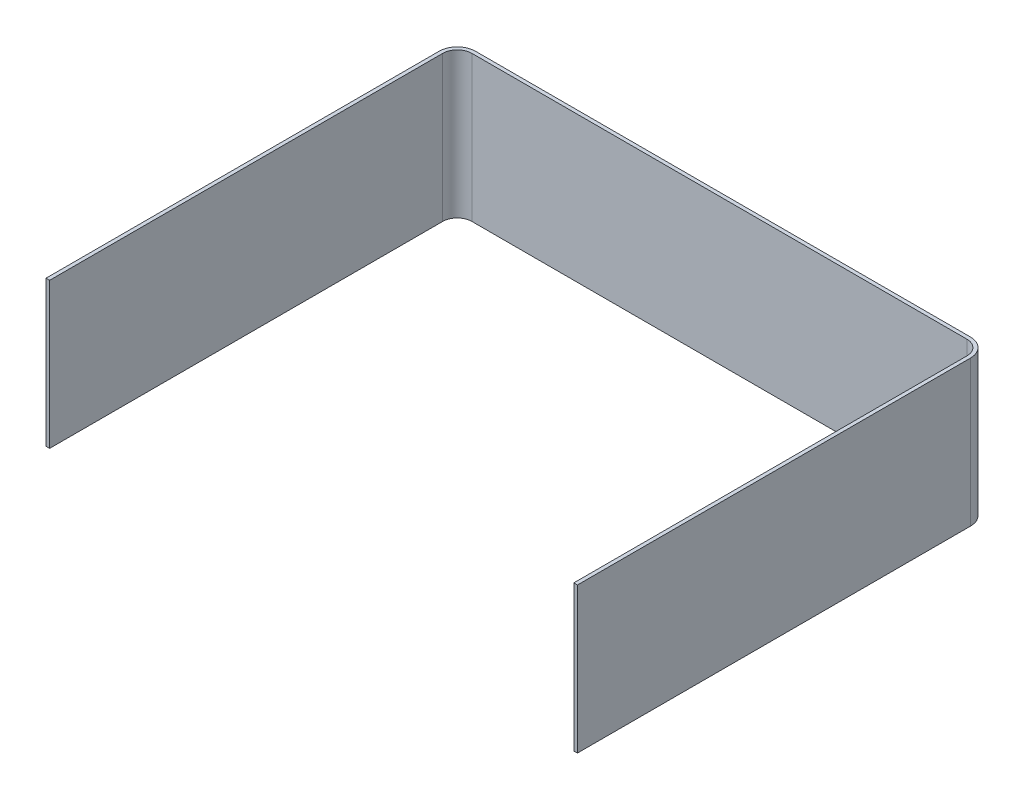
ISO-10303-21;
HEADER;
FILE_DESCRIPTION(('STEP AP214'),'2;1');
FILE_NAME('part.step','',(''),(''),'','','');
FILE_SCHEMA(('AUTOMOTIVE_DESIGN { 1 0 10303 214 1 1 1 1 }'));
ENDSEC;
DATA;
#1=APPLICATION_CONTEXT('core data for automotive mechanical design processes');
#2=APPLICATION_PROTOCOL_DEFINITION('international standard','automotive_design',2000,#1);
#3=PRODUCT_CONTEXT('',#1,'mechanical');
#4=PRODUCT('Part','Part','',(#3));
#5=PRODUCT_RELATED_PRODUCT_CATEGORY('part','',(#4));
#6=PRODUCT_DEFINITION_FORMATION('','',#4);
#7=PRODUCT_DEFINITION_CONTEXT('part definition',#1,'design');
#8=PRODUCT_DEFINITION('design','',#6,#7);
#9=PRODUCT_DEFINITION_SHAPE('','',#8);
#10=(LENGTH_UNIT() NAMED_UNIT(*) SI_UNIT(.MILLI.,.METRE.));
#11=(NAMED_UNIT(*) PLANE_ANGLE_UNIT() SI_UNIT($,.RADIAN.));
#12=(NAMED_UNIT(*) SI_UNIT($,.STERADIAN.) SOLID_ANGLE_UNIT());
#13=UNCERTAINTY_MEASURE_WITH_UNIT(LENGTH_MEASURE(1.E-05),#10,'distance_accuracy_value','');
#14=(GEOMETRIC_REPRESENTATION_CONTEXT(3) GLOBAL_UNCERTAINTY_ASSIGNED_CONTEXT((#13)) GLOBAL_UNIT_ASSIGNED_CONTEXT((#10,
#11,#12)) REPRESENTATION_CONTEXT('',''));
#15=CARTESIAN_POINT('',(0.,0.,0.));
#16=DIRECTION('',(0.,0.,1.));
#17=DIRECTION('',(1.,0.,0.));
#18=AXIS2_PLACEMENT_3D('',#15,#16,#17);
#19=CARTESIAN_POINT('',(215.9,127.,-165.1));
#20=DIRECTION('',(0.,-1.,0.));
#21=DIRECTION('',(0.,0.,-1.));
#22=AXIS2_PLACEMENT_3D('',#19,#20,#21);
#23=CYLINDRICAL_SURFACE('',#22,15.875);
#24=CARTESIAN_POINT('',(215.9,0.,-165.1));
#25=DIRECTION('',(0.,1.,0.));
#26=DIRECTION('',(0.,0.,1.));
#27=AXIS2_PLACEMENT_3D('',#24,#25,#26);
#28=CIRCLE('',#27,15.875);
#29=CARTESIAN_POINT('',(215.9,0.,-180.975));
#30=VERTEX_POINT('',#29);
#31=CARTESIAN_POINT('',(231.775,0.,-165.1));
#32=VERTEX_POINT('',#31);
#33=EDGE_CURVE('E163',#30,#32,#28,.F.);
#34=ORIENTED_EDGE('',*,*,#33,.F.);
#35=DIRECTION('',(0.,-1.,0.));
#36=VECTOR('',#35,1.);
#37=CARTESIAN_POINT('',(215.9,127.,-180.975));
#38=LINE('',#37,#36);
#39=CARTESIAN_POINT('',(215.9,127.,-180.975));
#40=VERTEX_POINT('',#39);
#41=EDGE_CURVE('E11',#40,#30,#38,.T.);
#42=ORIENTED_EDGE('',*,*,#41,.F.);
#43=CARTESIAN_POINT('',(215.9,127.,-165.1));
#44=DIRECTION('',(0.,1.,0.));
#45=DIRECTION('',(0.,0.,1.));
#46=AXIS2_PLACEMENT_3D('',#43,#44,#45);
#47=CIRCLE('',#46,15.875);
#48=CARTESIAN_POINT('',(231.775,127.,-165.1));
#49=VERTEX_POINT('',#48);
#50=EDGE_CURVE('E200',#40,#49,#47,.F.);
#51=ORIENTED_EDGE('',*,*,#50,.T.);
#52=DIRECTION('',(0.,-1.,0.));
#53=VECTOR('',#52,1.);
#54=CARTESIAN_POINT('',(231.775,127.,-165.1));
#55=LINE('',#54,#53);
#56=EDGE_CURVE('E102',#49,#32,#55,.T.);
#57=ORIENTED_EDGE('',*,*,#56,.T.);
#58=EDGE_LOOP('',(#34,#42,#51,#57));
#59=FACE_BOUND('',#58,.T.);
#60=ADVANCED_FACE('F39',(#59),#23,.T.);
#61=CARTESIAN_POINT('',(0.,127.,-180.975));
#62=DIRECTION('',(0.,0.,-1.));
#63=DIRECTION('',(-1.,0.,0.));
#64=AXIS2_PLACEMENT_3D('',#61,#62,#63);
#65=PLANE('',#64);
#66=DIRECTION('',(1.,0.,0.));
#67=VECTOR('',#66,1.);
#68=CARTESIAN_POINT('',(0.,0.,-180.975));
#69=LINE('',#68,#67);
#70=CARTESIAN_POINT('',(-215.9,0.,-180.975));
#71=VERTEX_POINT('',#70);
#72=EDGE_CURVE('E167',#71,#30,#69,.T.);
#73=ORIENTED_EDGE('',*,*,#72,.F.);
#74=DIRECTION('',(0.,-1.,0.));
#75=VECTOR('',#74,1.);
#76=CARTESIAN_POINT('',(-215.9,127.,-180.975));
#77=LINE('',#76,#75);
#78=CARTESIAN_POINT('',(-215.9,127.,-180.975));
#79=VERTEX_POINT('',#78);
#80=EDGE_CURVE('E48',#79,#71,#77,.T.);
#81=ORIENTED_EDGE('',*,*,#80,.F.);
#82=DIRECTION('',(1.,0.,0.));
#83=VECTOR('',#82,1.);
#84=CARTESIAN_POINT('',(0.,127.,-180.975));
#85=LINE('',#84,#83);
#86=EDGE_CURVE('E251',#79,#40,#85,.T.);
#87=ORIENTED_EDGE('',*,*,#86,.T.);
#88=ORIENTED_EDGE('',*,*,#41,.T.);
#89=EDGE_LOOP('',(#73,#81,#87,#88));
#90=FACE_BOUND('',#89,.T.);
#91=ADVANCED_FACE('F239',(#90),#65,.T.);
#92=CARTESIAN_POINT('',(-215.9,127.,-165.1));
#93=DIRECTION('',(0.,-1.,0.));
#94=DIRECTION('',(0.,0.,-1.));
#95=AXIS2_PLACEMENT_3D('',#92,#93,#94);
#96=CYLINDRICAL_SURFACE('',#95,15.875);
#97=CARTESIAN_POINT('',(-215.9,0.,-165.1));
#98=DIRECTION('',(0.,1.,0.));
#99=DIRECTION('',(0.,0.,1.));
#100=AXIS2_PLACEMENT_3D('',#97,#98,#99);
#101=CIRCLE('',#100,15.875);
#102=CARTESIAN_POINT('',(-231.775,0.,-165.1));
#103=VERTEX_POINT('',#102);
#104=EDGE_CURVE('E171',#103,#71,#101,.F.);
#105=ORIENTED_EDGE('',*,*,#104,.F.);
#106=DIRECTION('',(0.,-1.,0.));
#107=VECTOR('',#106,1.);
#108=CARTESIAN_POINT('',(-231.775,127.,-165.1));
#109=LINE('',#108,#107);
#110=CARTESIAN_POINT('',(-231.775,127.,-165.1));
#111=VERTEX_POINT('',#110);
#112=EDGE_CURVE('E226',#111,#103,#109,.T.);
#113=ORIENTED_EDGE('',*,*,#112,.F.);
#114=CARTESIAN_POINT('',(-215.9,127.,-165.1));
#115=DIRECTION('',(0.,1.,0.));
#116=DIRECTION('',(0.,0.,1.));
#117=AXIS2_PLACEMENT_3D('',#114,#115,#116);
#118=CIRCLE('',#117,15.875);
#119=EDGE_CURVE('E235',#111,#79,#118,.F.);
#120=ORIENTED_EDGE('',*,*,#119,.T.);
#121=ORIENTED_EDGE('',*,*,#80,.T.);
#122=EDGE_LOOP('',(#105,#113,#120,#121));
#123=FACE_BOUND('',#122,.T.);
#124=ADVANCED_FACE('F233',(#123),#96,.T.);
#125=CARTESIAN_POINT('',(-231.775,127.,0.));
#126=DIRECTION('',(-1.,0.,0.));
#127=DIRECTION('',(0.,0.,1.));
#128=AXIS2_PLACEMENT_3D('',#125,#126,#127);
#129=PLANE('',#128);
#130=DIRECTION('',(0.,0.,-1.));
#131=VECTOR('',#130,1.);
#132=CARTESIAN_POINT('',(-231.775,0.,0.));
#133=LINE('',#132,#131);
#134=CARTESIAN_POINT('',(-231.775,0.,177.8));
#135=VERTEX_POINT('',#134);
#136=EDGE_CURVE('E175',#135,#103,#133,.T.);
#137=ORIENTED_EDGE('',*,*,#136,.F.);
#138=DIRECTION('',(0.,-1.,0.));
#139=VECTOR('',#138,1.);
#140=CARTESIAN_POINT('',(-231.775,127.,177.8));
#141=LINE('',#140,#139);
#142=CARTESIAN_POINT('',(-231.775,127.,177.8));
#143=VERTEX_POINT('',#142);
#144=EDGE_CURVE('E223',#143,#135,#141,.T.);
#145=ORIENTED_EDGE('',*,*,#144,.F.);
#146=DIRECTION('',(0.,0.,-1.));
#147=VECTOR('',#146,1.);
#148=CARTESIAN_POINT('',(-231.775,127.,0.));
#149=LINE('',#148,#147);
#150=EDGE_CURVE('E250',#143,#111,#149,.T.);
#151=ORIENTED_EDGE('',*,*,#150,.T.);
#152=ORIENTED_EDGE('',*,*,#112,.T.);
#153=EDGE_LOOP('',(#137,#145,#151,#152));
#154=FACE_BOUND('',#153,.T.);
#155=ADVANCED_FACE('F246',(#154),#129,.T.);
#156=CARTESIAN_POINT('',(0.,127.,177.8));
#157=DIRECTION('',(0.,0.,-1.));
#158=DIRECTION('',(-1.,0.,0.));
#159=AXIS2_PLACEMENT_3D('',#156,#157,#158);
#160=PLANE('',#159);
#161=DIRECTION('',(1.,0.,0.));
#162=VECTOR('',#161,1.);
#163=CARTESIAN_POINT('',(0.,0.,177.8));
#164=LINE('',#163,#162);
#165=CARTESIAN_POINT('',(-228.6,0.,177.8));
#166=VERTEX_POINT('',#165);
#167=EDGE_CURVE('E179',#135,#166,#164,.T.);
#168=ORIENTED_EDGE('',*,*,#167,.T.);
#169=DIRECTION('',(0.,-1.,0.));
#170=VECTOR('',#169,1.);
#171=CARTESIAN_POINT('',(-228.6,127.,177.8));
#172=LINE('',#171,#170);
#173=CARTESIAN_POINT('',(-228.6,127.,177.8));
#174=VERTEX_POINT('',#173);
#175=EDGE_CURVE('E219',#174,#166,#172,.T.);
#176=ORIENTED_EDGE('',*,*,#175,.F.);
#177=DIRECTION('',(1.,0.,0.));
#178=VECTOR('',#177,1.);
#179=CARTESIAN_POINT('',(0.,127.,177.8));
#180=LINE('',#179,#178);
#181=EDGE_CURVE('E149',#143,#174,#180,.T.);
#182=ORIENTED_EDGE('',*,*,#181,.F.);
#183=ORIENTED_EDGE('',*,*,#144,.T.);
#184=EDGE_LOOP('',(#168,#176,#182,#183));
#185=FACE_BOUND('',#184,.T.);
#186=ADVANCED_FACE('F291',(#185),#160,.F.);
#187=CARTESIAN_POINT('',(-228.6,127.,0.));
#188=DIRECTION('',(-1.,0.,0.));
#189=DIRECTION('',(0.,0.,1.));
#190=AXIS2_PLACEMENT_3D('',#187,#188,#189);
#191=PLANE('',#190);
#192=DIRECTION('',(0.,0.,-1.));
#193=VECTOR('',#192,1.);
#194=CARTESIAN_POINT('',(-228.6,0.,0.));
#195=LINE('',#194,#193);
#196=CARTESIAN_POINT('',(-228.6,0.,-165.1));
#197=VERTEX_POINT('',#196);
#198=EDGE_CURVE('E182',#166,#197,#195,.T.);
#199=ORIENTED_EDGE('',*,*,#198,.T.);
#200=DIRECTION('',(0.,-1.,0.));
#201=VECTOR('',#200,1.);
#202=CARTESIAN_POINT('',(-228.6,127.,-165.1));
#203=LINE('',#202,#201);
#204=CARTESIAN_POINT('',(-228.6,127.,-165.1));
#205=VERTEX_POINT('',#204);
#206=EDGE_CURVE('E215',#205,#197,#203,.T.);
#207=ORIENTED_EDGE('',*,*,#206,.F.);
#208=DIRECTION('',(0.,0.,-1.));
#209=VECTOR('',#208,1.);
#210=CARTESIAN_POINT('',(-228.6,127.,0.));
#211=LINE('',#210,#209);
#212=EDGE_CURVE('E261',#174,#205,#211,.T.);
#213=ORIENTED_EDGE('',*,*,#212,.F.);
#214=ORIENTED_EDGE('',*,*,#175,.T.);
#215=EDGE_LOOP('',(#199,#207,#213,#214));
#216=FACE_BOUND('',#215,.T.);
#217=ADVANCED_FACE('F292',(#216),#191,.F.);
#218=CARTESIAN_POINT('',(-215.9,127.,-165.1));
#219=DIRECTION('',(0.,-1.,0.));
#220=DIRECTION('',(0.,0.,-1.));
#221=AXIS2_PLACEMENT_3D('',#218,#219,#220);
#222=CYLINDRICAL_SURFACE('',#221,12.7);
#223=CARTESIAN_POINT('',(-215.9,0.,-165.1));
#224=DIRECTION('',(0.,1.,0.));
#225=DIRECTION('',(0.,0.,1.));
#226=AXIS2_PLACEMENT_3D('',#223,#224,#225);
#227=CIRCLE('',#226,12.7);
#228=CARTESIAN_POINT('',(-215.9,0.,-177.8));
#229=VERTEX_POINT('',#228);
#230=EDGE_CURVE('E185',#197,#229,#227,.F.);
#231=ORIENTED_EDGE('',*,*,#230,.T.);
#232=DIRECTION('',(0.,-1.,0.));
#233=VECTOR('',#232,1.);
#234=CARTESIAN_POINT('',(-215.9,127.,-177.8));
#235=LINE('',#234,#233);
#236=CARTESIAN_POINT('',(-215.9,127.,-177.8));
#237=VERTEX_POINT('',#236);
#238=EDGE_CURVE('E211',#237,#229,#235,.T.);
#239=ORIENTED_EDGE('',*,*,#238,.F.);
#240=CARTESIAN_POINT('',(-215.9,127.,-165.1));
#241=DIRECTION('',(0.,1.,0.));
#242=DIRECTION('',(0.,0.,1.));
#243=AXIS2_PLACEMENT_3D('',#240,#241,#242);
#244=CIRCLE('',#243,12.7);
#245=EDGE_CURVE('E264',#205,#237,#244,.F.);
#246=ORIENTED_EDGE('',*,*,#245,.F.);
#247=ORIENTED_EDGE('',*,*,#206,.T.);
#248=EDGE_LOOP('',(#231,#239,#246,#247));
#249=FACE_BOUND('',#248,.T.);
#250=ADVANCED_FACE('F295',(#249),#222,.F.);
#251=CARTESIAN_POINT('',(0.,127.,-177.8));
#252=DIRECTION('',(0.,0.,-1.));
#253=DIRECTION('',(-1.,0.,0.));
#254=AXIS2_PLACEMENT_3D('',#251,#252,#253);
#255=PLANE('',#254);
#256=DIRECTION('',(1.,0.,0.));
#257=VECTOR('',#256,1.);
#258=CARTESIAN_POINT('',(0.,0.,-177.8));
#259=LINE('',#258,#257);
#260=CARTESIAN_POINT('',(215.9,0.,-177.8));
#261=VERTEX_POINT('',#260);
#262=EDGE_CURVE('E188',#229,#261,#259,.T.);
#263=ORIENTED_EDGE('',*,*,#262,.T.);
#264=DIRECTION('',(0.,-1.,0.));
#265=VECTOR('',#264,1.);
#266=CARTESIAN_POINT('',(215.9,127.,-177.8));
#267=LINE('',#266,#265);
#268=CARTESIAN_POINT('',(215.9,127.,-177.8));
#269=VERTEX_POINT('',#268);
#270=EDGE_CURVE('E207',#269,#261,#267,.T.);
#271=ORIENTED_EDGE('',*,*,#270,.F.);
#272=DIRECTION('',(1.,0.,0.));
#273=VECTOR('',#272,1.);
#274=CARTESIAN_POINT('',(0.,127.,-177.8));
#275=LINE('',#274,#273);
#276=EDGE_CURVE('E157',#237,#269,#275,.T.);
#277=ORIENTED_EDGE('',*,*,#276,.F.);
#278=ORIENTED_EDGE('',*,*,#238,.T.);
#279=EDGE_LOOP('',(#263,#271,#277,#278));
#280=FACE_BOUND('',#279,.T.);
#281=ADVANCED_FACE('F272',(#280),#255,.F.);
#282=CARTESIAN_POINT('',(215.9,127.,-165.1));
#283=DIRECTION('',(0.,-1.,0.));
#284=DIRECTION('',(0.,0.,-1.));
#285=AXIS2_PLACEMENT_3D('',#282,#283,#284);
#286=CYLINDRICAL_SURFACE('',#285,12.7);
#287=CARTESIAN_POINT('',(215.9,0.,-165.1));
#288=DIRECTION('',(0.,1.,0.));
#289=DIRECTION('',(0.,0.,1.));
#290=AXIS2_PLACEMENT_3D('',#287,#288,#289);
#291=CIRCLE('',#290,12.7);
#292=CARTESIAN_POINT('',(228.6,0.,-165.1));
#293=VERTEX_POINT('',#292);
#294=EDGE_CURVE('E191',#261,#293,#291,.F.);
#295=ORIENTED_EDGE('',*,*,#294,.T.);
#296=DIRECTION('',(0.,-1.,0.));
#297=VECTOR('',#296,1.);
#298=CARTESIAN_POINT('',(228.6,127.,-165.1));
#299=LINE('',#298,#297);
#300=CARTESIAN_POINT('',(228.6,127.,-165.1));
#301=VERTEX_POINT('',#300);
#302=EDGE_CURVE('E142',#301,#293,#299,.T.);
#303=ORIENTED_EDGE('',*,*,#302,.F.);
#304=CARTESIAN_POINT('',(215.9,127.,-165.1));
#305=DIRECTION('',(0.,1.,0.));
#306=DIRECTION('',(0.,0.,1.));
#307=AXIS2_PLACEMENT_3D('',#304,#305,#306);
#308=CIRCLE('',#307,12.7);
#309=EDGE_CURVE('E152',#269,#301,#308,.F.);
#310=ORIENTED_EDGE('',*,*,#309,.F.);
#311=ORIENTED_EDGE('',*,*,#270,.T.);
#312=EDGE_LOOP('',(#295,#303,#310,#311));
#313=FACE_BOUND('',#312,.T.);
#314=ADVANCED_FACE('F276',(#313),#286,.F.);
#315=CARTESIAN_POINT('',(228.6,127.,0.));
#316=DIRECTION('',(-1.,0.,0.));
#317=DIRECTION('',(0.,0.,1.));
#318=AXIS2_PLACEMENT_3D('',#315,#316,#317);
#319=PLANE('',#318);
#320=DIRECTION('',(0.,0.,-1.));
#321=VECTOR('',#320,1.);
#322=CARTESIAN_POINT('',(228.6,0.,0.));
#323=LINE('',#322,#321);
#324=CARTESIAN_POINT('',(228.6,0.,177.8));
#325=VERTEX_POINT('',#324);
#326=EDGE_CURVE('E140',#325,#293,#323,.T.);
#327=ORIENTED_EDGE('',*,*,#326,.F.);
#328=DIRECTION('',(0.,-1.,0.));
#329=VECTOR('',#328,1.);
#330=CARTESIAN_POINT('',(228.6,127.,177.8));
#331=LINE('',#330,#329);
#332=CARTESIAN_POINT('',(228.6,127.,177.8));
#333=VERTEX_POINT('',#332);
#334=EDGE_CURVE('E134',#333,#325,#331,.T.);
#335=ORIENTED_EDGE('',*,*,#334,.F.);
#336=DIRECTION('',(0.,0.,-1.));
#337=VECTOR('',#336,1.);
#338=CARTESIAN_POINT('',(228.6,127.,0.));
#339=LINE('',#338,#337);
#340=EDGE_CURVE('E138',#333,#301,#339,.T.);
#341=ORIENTED_EDGE('',*,*,#340,.T.);
#342=ORIENTED_EDGE('',*,*,#302,.T.);
#343=EDGE_LOOP('',(#327,#335,#341,#342));
#344=FACE_BOUND('',#343,.T.);
#345=ADVANCED_FACE('F136',(#344),#319,.T.);
#346=CARTESIAN_POINT('',(231.775,0.,177.8));
#347=VERTEX_POINT('',#346);
#348=EDGE_CURVE('E95',#325,#347,#164,.T.);
#349=ORIENTED_EDGE('',*,*,#348,.T.);
#350=DIRECTION('',(0.,-1.,0.));
#351=VECTOR('',#350,1.);
#352=CARTESIAN_POINT('',(231.775,127.,177.8));
#353=LINE('',#352,#351);
#354=CARTESIAN_POINT('',(231.775,127.,177.8));
#355=VERTEX_POINT('',#354);
#356=EDGE_CURVE('E143',#355,#347,#353,.T.);
#357=ORIENTED_EDGE('',*,*,#356,.F.);
#358=EDGE_CURVE('E145',#333,#355,#180,.T.);
#359=ORIENTED_EDGE('',*,*,#358,.F.);
#360=ORIENTED_EDGE('',*,*,#334,.T.);
#361=EDGE_LOOP('',(#349,#357,#359,#360));
#362=FACE_BOUND('',#361,.T.);
#363=ADVANCED_FACE('F146',(#362),#160,.F.);
#364=CARTESIAN_POINT('',(231.775,127.,0.));
#365=DIRECTION('',(-1.,0.,0.));
#366=DIRECTION('',(0.,0.,1.));
#367=AXIS2_PLACEMENT_3D('',#364,#365,#366);
#368=PLANE('',#367);
#369=DIRECTION('',(0.,0.,-1.));
#370=VECTOR('',#369,1.);
#371=CARTESIAN_POINT('',(231.775,0.,0.));
#372=LINE('',#371,#370);
#373=EDGE_CURVE('E197',#347,#32,#372,.T.);
#374=ORIENTED_EDGE('',*,*,#373,.T.);
#375=ORIENTED_EDGE('',*,*,#56,.F.);
#376=DIRECTION('',(0.,0.,-1.));
#377=VECTOR('',#376,1.);
#378=CARTESIAN_POINT('',(231.775,127.,0.));
#379=LINE('',#378,#377);
#380=EDGE_CURVE('E56',#355,#49,#379,.T.);
#381=ORIENTED_EDGE('',*,*,#380,.F.);
#382=ORIENTED_EDGE('',*,*,#356,.T.);
#383=EDGE_LOOP('',(#374,#375,#381,#382));
#384=FACE_BOUND('',#383,.T.);
#385=ADVANCED_FACE('F308',(#384),#368,.F.);
#386=CARTESIAN_POINT('',(0.,127.,0.));
#387=DIRECTION('',(0.,1.,0.));
#388=DIRECTION('',(0.,0.,1.));
#389=AXIS2_PLACEMENT_3D('',#386,#387,#388);
#390=PLANE('',#389);
#391=ORIENTED_EDGE('',*,*,#50,.F.);
#392=ORIENTED_EDGE('',*,*,#86,.F.);
#393=ORIENTED_EDGE('',*,*,#119,.F.);
#394=ORIENTED_EDGE('',*,*,#150,.F.);
#395=ORIENTED_EDGE('',*,*,#181,.T.);
#396=ORIENTED_EDGE('',*,*,#212,.T.);
#397=ORIENTED_EDGE('',*,*,#245,.T.);
#398=ORIENTED_EDGE('',*,*,#276,.T.);
#399=ORIENTED_EDGE('',*,*,#309,.T.);
#400=ORIENTED_EDGE('',*,*,#340,.F.);
#401=ORIENTED_EDGE('',*,*,#358,.T.);
#402=ORIENTED_EDGE('',*,*,#380,.T.);
#403=EDGE_LOOP('',(#391,#392,#393,#394,#395,#396,#397,#398,#399,#400,#401,#402));
#404=FACE_BOUND('',#403,.T.);
#405=ADVANCED_FACE('F150',(#404),#390,.T.);
#406=CARTESIAN_POINT('',(0.,0.,0.));
#407=DIRECTION('',(0.,1.,0.));
#408=DIRECTION('',(0.,0.,1.));
#409=AXIS2_PLACEMENT_3D('',#406,#407,#408);
#410=PLANE('',#409);
#411=ORIENTED_EDGE('',*,*,#33,.T.);
#412=ORIENTED_EDGE('',*,*,#373,.F.);
#413=ORIENTED_EDGE('',*,*,#348,.F.);
#414=ORIENTED_EDGE('',*,*,#326,.T.);
#415=ORIENTED_EDGE('',*,*,#294,.F.);
#416=ORIENTED_EDGE('',*,*,#262,.F.);
#417=ORIENTED_EDGE('',*,*,#230,.F.);
#418=ORIENTED_EDGE('',*,*,#198,.F.);
#419=ORIENTED_EDGE('',*,*,#167,.F.);
#420=ORIENTED_EDGE('',*,*,#136,.T.);
#421=ORIENTED_EDGE('',*,*,#104,.T.);
#422=ORIENTED_EDGE('',*,*,#72,.T.);
#423=EDGE_LOOP('',(#411,#412,#413,#414,#415,#416,#417,#418,#419,#420,#421,#422));
#424=FACE_BOUND('',#423,.T.);
#425=ADVANCED_FACE('F241',(#424),#410,.F.);
#426=CLOSED_SHELL('',(#60,#91,#124,#155,#186,#217,#250,#281,#314,#345,#363,#385,#405,#425));
#427=MANIFOLD_SOLID_BREP('B2',#426);
#428=ADVANCED_BREP_SHAPE_REPRESENTATION('',(#18,#427),#14);
#429=SHAPE_DEFINITION_REPRESENTATION(#9,#428);
ENDSEC;
END-ISO-10303-21;
